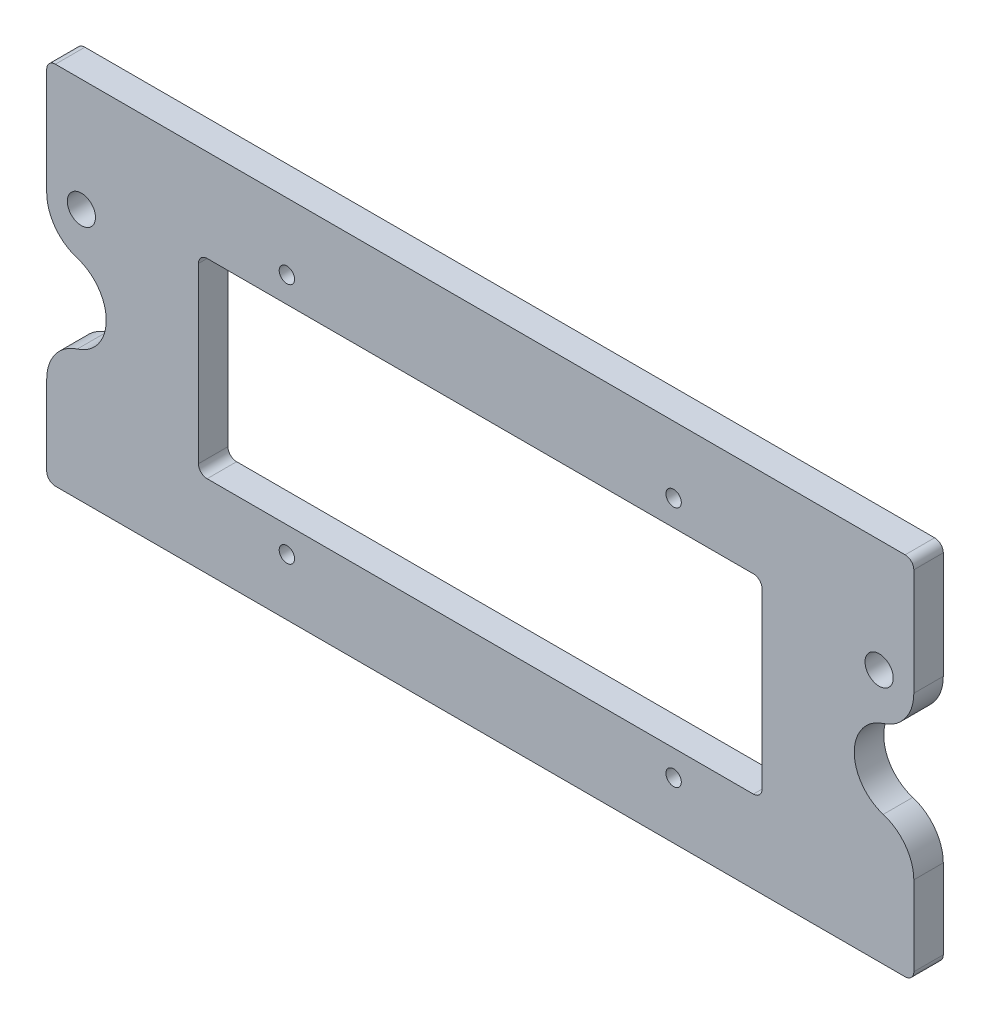
ISO-10303-21;
HEADER;
FILE_DESCRIPTION(('STEP AP214'),'2;1');
FILE_NAME('part.step','',(''),(''),'','','');
FILE_SCHEMA(('AUTOMOTIVE_DESIGN { 1 0 10303 214 1 1 1 1 }'));
ENDSEC;
DATA;
#1=APPLICATION_CONTEXT('core data for automotive mechanical design processes');
#2=APPLICATION_PROTOCOL_DEFINITION('international standard','automotive_design',2000,#1);
#3=PRODUCT_CONTEXT('',#1,'mechanical');
#4=PRODUCT('Part','Part','',(#3));
#5=PRODUCT_RELATED_PRODUCT_CATEGORY('part','',(#4));
#6=PRODUCT_DEFINITION_FORMATION('','',#4);
#7=PRODUCT_DEFINITION_CONTEXT('part definition',#1,'design');
#8=PRODUCT_DEFINITION('design','',#6,#7);
#9=PRODUCT_DEFINITION_SHAPE('','',#8);
#10=(LENGTH_UNIT() NAMED_UNIT(*) SI_UNIT(.MILLI.,.METRE.));
#11=(NAMED_UNIT(*) PLANE_ANGLE_UNIT() SI_UNIT($,.RADIAN.));
#12=(NAMED_UNIT(*) SI_UNIT($,.STERADIAN.) SOLID_ANGLE_UNIT());
#13=UNCERTAINTY_MEASURE_WITH_UNIT(LENGTH_MEASURE(1.E-05),#10,'distance_accuracy_value','');
#14=(GEOMETRIC_REPRESENTATION_CONTEXT(3) GLOBAL_UNCERTAINTY_ASSIGNED_CONTEXT((#13)) GLOBAL_UNIT_ASSIGNED_CONTEXT((#10,
#11,#12)) REPRESENTATION_CONTEXT('',''));
#15=CARTESIAN_POINT('',(0.,0.,0.));
#16=DIRECTION('',(0.,0.,1.));
#17=DIRECTION('',(1.,0.,0.));
#18=AXIS2_PLACEMENT_3D('',#15,#16,#17);
#19=CARTESIAN_POINT('',(100.,-42.15,6.8));
#20=DIRECTION('',(-1.,0.,0.));
#21=DIRECTION('',(0.,0.,1.));
#22=AXIS2_PLACEMENT_3D('',#19,#20,#21);
#23=PLANE('',#22);
#24=DIRECTION('',(0.,1.,0.));
#25=VECTOR('',#24,1.);
#26=CARTESIAN_POINT('',(100.,-42.15,6.8));
#27=LINE('',#26,#25);
#28=CARTESIAN_POINT('',(100.,15.4785660950768,6.8));
#29=VERTEX_POINT('',#28);
#30=CARTESIAN_POINT('',(100.,40.15,6.8));
#31=VERTEX_POINT('',#30);
#32=EDGE_CURVE('E572',#29,#31,#27,.T.);
#33=ORIENTED_EDGE('',*,*,#32,.F.);
#34=DIRECTION('',(0.,0.,-1.));
#35=VECTOR('',#34,1.);
#36=CARTESIAN_POINT('',(100.,15.4785660950769,0.));
#37=LINE('',#36,#35);
#38=CARTESIAN_POINT('',(100.,15.4785660950768,0.));
#39=VERTEX_POINT('',#38);
#40=EDGE_CURVE('E416',#29,#39,#37,.T.);
#41=ORIENTED_EDGE('',*,*,#40,.T.);
#42=DIRECTION('',(0.,1.,0.));
#43=VECTOR('',#42,1.);
#44=CARTESIAN_POINT('',(100.,-42.15,0.));
#45=LINE('',#44,#43);
#46=CARTESIAN_POINT('',(100.,40.15,0.));
#47=VERTEX_POINT('',#46);
#48=EDGE_CURVE('E295',#39,#47,#45,.T.);
#49=ORIENTED_EDGE('',*,*,#48,.T.);
#50=DIRECTION('',(0.,0.,-1.));
#51=VECTOR('',#50,1.);
#52=CARTESIAN_POINT('',(100.,40.15,6.8));
#53=LINE('',#52,#51);
#54=EDGE_CURVE('E264',#47,#31,#53,.F.);
#55=ORIENTED_EDGE('',*,*,#54,.T.);
#56=EDGE_LOOP('',(#33,#41,#49,#55));
#57=FACE_BOUND('',#56,.T.);
#58=ADVANCED_FACE('F48',(#57),#23,.F.);
#59=CARTESIAN_POINT('',(100.,-40.15,0.));
#60=VERTEX_POINT('',#59);
#61=CARTESIAN_POINT('',(100.,-21.7786158665726,0.));
#62=VERTEX_POINT('',#61);
#63=EDGE_CURVE('E286',#60,#62,#45,.T.);
#64=ORIENTED_EDGE('',*,*,#63,.T.);
#65=DIRECTION('',(0.,0.,-1.));
#66=VECTOR('',#65,1.);
#67=CARTESIAN_POINT('',(100.,-21.7786158665726,6.8));
#68=LINE('',#67,#66);
#69=CARTESIAN_POINT('',(100.,-21.7786158665726,6.8));
#70=VERTEX_POINT('',#69);
#71=EDGE_CURVE('E429',#62,#70,#68,.F.);
#72=ORIENTED_EDGE('',*,*,#71,.T.);
#73=CARTESIAN_POINT('',(100.,-40.15,6.8));
#74=VERTEX_POINT('',#73);
#75=EDGE_CURVE('E573',#74,#70,#27,.T.);
#76=ORIENTED_EDGE('',*,*,#75,.F.);
#77=DIRECTION('',(0.,0.,-1.));
#78=VECTOR('',#77,1.);
#79=CARTESIAN_POINT('',(100.,-40.15,6.8));
#80=LINE('',#79,#78);
#81=EDGE_CURVE('E268',#74,#60,#80,.T.);
#82=ORIENTED_EDGE('',*,*,#81,.T.);
#83=EDGE_LOOP('',(#64,#72,#76,#82));
#84=FACE_BOUND('',#83,.T.);
#85=ADVANCED_FACE('F593',(#84),#23,.F.);
#86=CARTESIAN_POINT('',(0.,0.,6.8));
#87=DIRECTION('',(0.,0.,1.));
#88=DIRECTION('',(1.,0.,0.));
#89=AXIS2_PLACEMENT_3D('',#86,#87,#88);
#90=PLANE('',#89);
#91=CARTESIAN_POINT('',(-44.6,-29.0722,6.8));
#92=DIRECTION('',(0.,0.,1.));
#93=DIRECTION('',(1.,0.,0.));
#94=AXIS2_PLACEMENT_3D('',#91,#92,#93);
#95=CIRCLE('',#94,1.775);
#96=CARTESIAN_POINT('',(-42.825,-29.0722,6.8));
#97=VERTEX_POINT('',#96);
#98=EDGE_CURVE('E450',#97,#97,#95,.T.);
#99=ORIENTED_EDGE('',*,*,#98,.F.);
#100=EDGE_LOOP('',(#99));
#101=FACE_BOUND('',#100,.T.);
#102=CARTESIAN_POINT('',(44.6,-29.0722,6.8));
#103=DIRECTION('',(0.,0.,1.));
#104=DIRECTION('',(1.,0.,0.));
#105=AXIS2_PLACEMENT_3D('',#102,#103,#104);
#106=CIRCLE('',#105,1.775);
#107=CARTESIAN_POINT('',(46.375,-29.0722,6.8));
#108=VERTEX_POINT('',#107);
#109=EDGE_CURVE('E501',#108,#108,#106,.T.);
#110=ORIENTED_EDGE('',*,*,#109,.F.);
#111=EDGE_LOOP('',(#110));
#112=FACE_BOUND('',#111,.T.);
#113=CARTESIAN_POINT('',(44.6,26.7722,6.8));
#114=DIRECTION('',(0.,0.,1.));
#115=DIRECTION('',(1.,0.,0.));
#116=AXIS2_PLACEMENT_3D('',#113,#114,#115);
#117=CIRCLE('',#116,1.775);
#118=CARTESIAN_POINT('',(46.375,26.7722,6.8));
#119=VERTEX_POINT('',#118);
#120=EDGE_CURVE('E509',#119,#119,#117,.T.);
#121=ORIENTED_EDGE('',*,*,#120,.F.);
#122=EDGE_LOOP('',(#121));
#123=FACE_BOUND('',#122,.T.);
#124=CARTESIAN_POINT('',(-44.6,26.7722,6.8));
#125=DIRECTION('',(0.,0.,1.));
#126=DIRECTION('',(1.,0.,0.));
#127=AXIS2_PLACEMENT_3D('',#124,#125,#126);
#128=CIRCLE('',#127,1.775);
#129=CARTESIAN_POINT('',(-42.825,26.7722,6.8));
#130=VERTEX_POINT('',#129);
#131=EDGE_CURVE('E517',#130,#130,#128,.T.);
#132=ORIENTED_EDGE('',*,*,#131,.F.);
#133=EDGE_LOOP('',(#132));
#134=FACE_BOUND('',#133,.T.);
#135=DIRECTION('',(0.,-1.,0.));
#136=VECTOR('',#135,1.);
#137=CARTESIAN_POINT('',(-65.,20.85,6.8));
#138=LINE('',#137,#136);
#139=CARTESIAN_POINT('',(-65.,18.85,6.8));
#140=VERTEX_POINT('',#139);
#141=CARTESIAN_POINT('',(-65.,-21.15,6.8));
#142=VERTEX_POINT('',#141);
#143=EDGE_CURVE('E525',#140,#142,#138,.T.);
#144=ORIENTED_EDGE('',*,*,#143,.F.);
#145=CARTESIAN_POINT('',(-63.,18.85,6.8));
#146=DIRECTION('',(0.,0.,1.));
#147=DIRECTION('',(1.,0.,0.));
#148=AXIS2_PLACEMENT_3D('',#145,#146,#147);
#149=CIRCLE('',#148,2.);
#150=CARTESIAN_POINT('',(-63.,20.85,6.8));
#151=VERTEX_POINT('',#150);
#152=EDGE_CURVE('E377',#140,#151,#149,.F.);
#153=ORIENTED_EDGE('',*,*,#152,.T.);
#154=DIRECTION('',(-1.,0.,0.));
#155=VECTOR('',#154,1.);
#156=CARTESIAN_POINT('',(65.,20.85,6.8));
#157=LINE('',#156,#155);
#158=CARTESIAN_POINT('',(63.,20.85,6.8));
#159=VERTEX_POINT('',#158);
#160=EDGE_CURVE('E534',#159,#151,#157,.T.);
#161=ORIENTED_EDGE('',*,*,#160,.F.);
#162=CARTESIAN_POINT('',(63.,18.85,6.8));
#163=DIRECTION('',(0.,0.,1.));
#164=DIRECTION('',(1.,0.,0.));
#165=AXIS2_PLACEMENT_3D('',#162,#163,#164);
#166=CIRCLE('',#165,2.);
#167=CARTESIAN_POINT('',(65.,18.85,6.8));
#168=VERTEX_POINT('',#167);
#169=EDGE_CURVE('E365',#159,#168,#166,.F.);
#170=ORIENTED_EDGE('',*,*,#169,.T.);
#171=DIRECTION('',(0.,1.,0.));
#172=VECTOR('',#171,1.);
#173=CARTESIAN_POINT('',(65.,-23.15,6.8));
#174=LINE('',#173,#172);
#175=CARTESIAN_POINT('',(65.,-21.15,6.8));
#176=VERTEX_POINT('',#175);
#177=EDGE_CURVE('E554',#176,#168,#174,.T.);
#178=ORIENTED_EDGE('',*,*,#177,.F.);
#179=CARTESIAN_POINT('',(63.,-21.15,6.8));
#180=DIRECTION('',(0.,0.,1.));
#181=DIRECTION('',(1.,0.,0.));
#182=AXIS2_PLACEMENT_3D('',#179,#180,#181);
#183=CIRCLE('',#182,2.);
#184=CARTESIAN_POINT('',(63.,-23.15,6.8));
#185=VERTEX_POINT('',#184);
#186=EDGE_CURVE('E371',#176,#185,#183,.F.);
#187=ORIENTED_EDGE('',*,*,#186,.T.);
#188=DIRECTION('',(1.,0.,0.));
#189=VECTOR('',#188,1.);
#190=CARTESIAN_POINT('',(-65.,-23.15,6.8));
#191=LINE('',#190,#189);
#192=CARTESIAN_POINT('',(-63.,-23.15,6.8));
#193=VERTEX_POINT('',#192);
#194=EDGE_CURVE('E550',#193,#185,#191,.T.);
#195=ORIENTED_EDGE('',*,*,#194,.F.);
#196=CARTESIAN_POINT('',(-63.,-21.15,6.8));
#197=DIRECTION('',(0.,0.,1.));
#198=DIRECTION('',(1.,0.,0.));
#199=AXIS2_PLACEMENT_3D('',#196,#197,#198);
#200=CIRCLE('',#199,2.);
#201=EDGE_CURVE('E383',#193,#142,#200,.F.);
#202=ORIENTED_EDGE('',*,*,#201,.T.);
#203=EDGE_LOOP('',(#144,#153,#161,#170,#178,#187,#195,#202));
#204=FACE_BOUND('',#203,.T.);
#205=CARTESIAN_POINT('',(92.,16.15,6.8));
#206=DIRECTION('',(0.,0.,1.));
#207=DIRECTION('',(1.,0.,0.));
#208=AXIS2_PLACEMENT_3D('',#205,#206,#207);
#209=CIRCLE('',#208,3.25000000000001);
#210=CARTESIAN_POINT('',(95.25,16.15,6.8));
#211=VERTEX_POINT('',#210);
#212=EDGE_CURVE('E546',#211,#211,#209,.T.);
#213=ORIENTED_EDGE('',*,*,#212,.F.);
#214=EDGE_LOOP('',(#213));
#215=FACE_BOUND('',#214,.T.);
#216=CARTESIAN_POINT('',(-92.,16.15,6.8));
#217=DIRECTION('',(0.,0.,1.));
#218=DIRECTION('',(1.,0.,0.));
#219=AXIS2_PLACEMENT_3D('',#216,#217,#218);
#220=CIRCLE('',#219,3.25000000000001);
#221=CARTESIAN_POINT('',(-88.75,16.15,6.8));
#222=VERTEX_POINT('',#221);
#223=EDGE_CURVE('E470',#222,#222,#220,.T.);
#224=ORIENTED_EDGE('',*,*,#223,.F.);
#225=EDGE_LOOP('',(#224));
#226=FACE_BOUND('',#225,.T.);
#227=CARTESIAN_POINT('',(95.7641649932263,-3.15002488574789,6.8));
#228=DIRECTION('',(0.,0.,-1.));
#229=DIRECTION('',(-1.,0.,0.));
#230=AXIS2_PLACEMENT_3D('',#227,#228,#229);
#231=CIRCLE('',#230,9.5);
#232=CARTESIAN_POINT('',(92.9559820478083,-12.2254922866625,6.8));
#233=VERTEX_POINT('',#232);
#234=CARTESIAN_POINT('',(92.9559820478083,5.92544251516673,6.8));
#235=VERTEX_POINT('',#234);
#236=EDGE_CURVE('E451',#233,#235,#231,.T.);
#237=ORIENTED_EDGE('',*,*,#236,.T.);
#238=CARTESIAN_POINT('',(90.,15.4785660950769,6.8));
#239=DIRECTION('',(0.,0.,1.));
#240=DIRECTION('',(1.,0.,0.));
#241=AXIS2_PLACEMENT_3D('',#238,#239,#240);
#242=CIRCLE('',#241,10.);
#243=EDGE_CURVE('E413',#235,#29,#242,.T.);
#244=ORIENTED_EDGE('',*,*,#243,.T.);
#245=ORIENTED_EDGE('',*,*,#32,.T.);
#246=CARTESIAN_POINT('',(98.,40.15,6.8));
#247=DIRECTION('',(0.,0.,1.));
#248=DIRECTION('',(1.,0.,0.));
#249=AXIS2_PLACEMENT_3D('',#246,#247,#248);
#250=CIRCLE('',#249,2.);
#251=CARTESIAN_POINT('',(98.,42.15,6.8));
#252=VERTEX_POINT('',#251);
#253=EDGE_CURVE('E320',#31,#252,#250,.T.);
#254=ORIENTED_EDGE('',*,*,#253,.T.);
#255=DIRECTION('',(-1.,0.,0.));
#256=VECTOR('',#255,1.);
#257=CARTESIAN_POINT('',(100.,42.15,6.8));
#258=LINE('',#257,#256);
#259=CARTESIAN_POINT('',(-98.,42.15,6.8));
#260=VERTEX_POINT('',#259);
#261=EDGE_CURVE('E278',#252,#260,#258,.T.);
#262=ORIENTED_EDGE('',*,*,#261,.T.);
#263=CARTESIAN_POINT('',(-98.,40.15,6.8));
#264=DIRECTION('',(0.,0.,1.));
#265=DIRECTION('',(1.,0.,0.));
#266=AXIS2_PLACEMENT_3D('',#263,#264,#265);
#267=CIRCLE('',#266,2.);
#268=CARTESIAN_POINT('',(-100.,40.15,6.8));
#269=VERTEX_POINT('',#268);
#270=EDGE_CURVE('E312',#260,#269,#267,.T.);
#271=ORIENTED_EDGE('',*,*,#270,.T.);
#272=DIRECTION('',(0.,-1.,0.));
#273=VECTOR('',#272,1.);
#274=CARTESIAN_POINT('',(-100.,-42.15,6.8));
#275=LINE('',#274,#273);
#276=CARTESIAN_POINT('',(-100.,15.4785660950768,6.8));
#277=VERTEX_POINT('',#276);
#278=EDGE_CURVE('E291',#269,#277,#275,.T.);
#279=ORIENTED_EDGE('',*,*,#278,.T.);
#280=CARTESIAN_POINT('',(-90.,15.4785660950769,6.8));
#281=DIRECTION('',(0.,0.,1.));
#282=DIRECTION('',(1.,0.,0.));
#283=AXIS2_PLACEMENT_3D('',#280,#281,#282);
#284=CIRCLE('',#283,10.);
#285=CARTESIAN_POINT('',(-92.9559820478083,5.92544251516673,6.8));
#286=VERTEX_POINT('',#285);
#287=EDGE_CURVE('E404',#277,#286,#284,.T.);
#288=ORIENTED_EDGE('',*,*,#287,.T.);
#289=CARTESIAN_POINT('',(-95.7641649932263,-3.15002488574789,6.8));
#290=DIRECTION('',(0.,0.,1.));
#291=DIRECTION('',(1.,0.,0.));
#292=AXIS2_PLACEMENT_3D('',#289,#290,#291);
#293=CIRCLE('',#292,9.5);
#294=CARTESIAN_POINT('',(-92.9559820478083,-12.2254922866625,6.8));
#295=VERTEX_POINT('',#294);
#296=EDGE_CURVE('E442',#295,#286,#293,.T.);
#297=ORIENTED_EDGE('',*,*,#296,.F.);
#298=CARTESIAN_POINT('',(-90.,-21.7786158665726,6.8));
#299=DIRECTION('',(0.,0.,1.));
#300=DIRECTION('',(1.,0.,0.));
#301=AXIS2_PLACEMENT_3D('',#298,#299,#300);
#302=CIRCLE('',#301,10.);
#303=CARTESIAN_POINT('',(-100.,-21.7786158665726,6.8));
#304=VERTEX_POINT('',#303);
#305=EDGE_CURVE('E407',#295,#304,#302,.T.);
#306=ORIENTED_EDGE('',*,*,#305,.T.);
#307=CARTESIAN_POINT('',(-100.,-40.15,6.8));
#308=VERTEX_POINT('',#307);
#309=EDGE_CURVE('E285',#304,#308,#275,.T.);
#310=ORIENTED_EDGE('',*,*,#309,.T.);
#311=CARTESIAN_POINT('',(-98.,-40.15,6.8));
#312=DIRECTION('',(0.,0.,1.));
#313=DIRECTION('',(1.,0.,0.));
#314=AXIS2_PLACEMENT_3D('',#311,#312,#313);
#315=CIRCLE('',#314,2.);
#316=CARTESIAN_POINT('',(-98.,-42.15,6.8));
#317=VERTEX_POINT('',#316);
#318=EDGE_CURVE('E315',#308,#317,#315,.T.);
#319=ORIENTED_EDGE('',*,*,#318,.T.);
#320=DIRECTION('',(1.,0.,0.));
#321=VECTOR('',#320,1.);
#322=CARTESIAN_POINT('',(100.,-42.15,6.8));
#323=LINE('',#322,#321);
#324=CARTESIAN_POINT('',(98.,-42.15,6.8));
#325=VERTEX_POINT('',#324);
#326=EDGE_CURVE('E570',#317,#325,#323,.T.);
#327=ORIENTED_EDGE('',*,*,#326,.T.);
#328=CARTESIAN_POINT('',(98.,-40.15,6.8));
#329=DIRECTION('',(0.,0.,1.));
#330=DIRECTION('',(1.,0.,0.));
#331=AXIS2_PLACEMENT_3D('',#328,#329,#330);
#332=CIRCLE('',#331,2.);
#333=EDGE_CURVE('E318',#325,#74,#332,.T.);
#334=ORIENTED_EDGE('',*,*,#333,.T.);
#335=ORIENTED_EDGE('',*,*,#75,.T.);
#336=CARTESIAN_POINT('',(90.,-21.7786158665726,6.8));
#337=DIRECTION('',(0.,0.,1.));
#338=DIRECTION('',(1.,0.,0.));
#339=AXIS2_PLACEMENT_3D('',#336,#337,#338);
#340=CIRCLE('',#339,10.);
#341=EDGE_CURVE('E410',#70,#233,#340,.T.);
#342=ORIENTED_EDGE('',*,*,#341,.T.);
#343=EDGE_LOOP('',(#237,#244,#245,#254,#262,#271,#279,#288,#297,#306,#310,#319,#327,#334,#335,#342));
#344=FACE_BOUND('',#343,.T.);
#345=ADVANCED_FACE('F447',(#101,#112,#123,#134,#204,#215,#226,#344),#90,.T.);
#346=CARTESIAN_POINT('',(0.,0.,0.));
#347=DIRECTION('',(0.,0.,1.));
#348=DIRECTION('',(1.,0.,0.));
#349=AXIS2_PLACEMENT_3D('',#346,#347,#348);
#350=PLANE('',#349);
#351=CARTESIAN_POINT('',(-92.,16.15,0.));
#352=DIRECTION('',(0.,0.,1.));
#353=DIRECTION('',(1.,0.,0.));
#354=AXIS2_PLACEMENT_3D('',#351,#352,#353);
#355=CIRCLE('',#354,3.25000000000001);
#356=CARTESIAN_POINT('',(-88.75,16.15,0.));
#357=VERTEX_POINT('',#356);
#358=EDGE_CURVE('E463',#357,#357,#355,.T.);
#359=ORIENTED_EDGE('',*,*,#358,.T.);
#360=EDGE_LOOP('',(#359));
#361=FACE_BOUND('',#360,.T.);
#362=CARTESIAN_POINT('',(92.,16.15,0.));
#363=DIRECTION('',(0.,0.,1.));
#364=DIRECTION('',(1.,0.,0.));
#365=AXIS2_PLACEMENT_3D('',#362,#363,#364);
#366=CIRCLE('',#365,3.25000000000001);
#367=CARTESIAN_POINT('',(95.25,16.15,0.));
#368=VERTEX_POINT('',#367);
#369=EDGE_CURVE('E560',#368,#368,#366,.T.);
#370=ORIENTED_EDGE('',*,*,#369,.T.);
#371=EDGE_LOOP('',(#370));
#372=FACE_BOUND('',#371,.T.);
#373=DIRECTION('',(0.,1.,0.));
#374=VECTOR('',#373,1.);
#375=CARTESIAN_POINT('',(65.,-23.15,0.));
#376=LINE('',#375,#374);
#377=CARTESIAN_POINT('',(65.,-21.15,0.));
#378=VERTEX_POINT('',#377);
#379=CARTESIAN_POINT('',(65.,18.85,0.));
#380=VERTEX_POINT('',#379);
#381=EDGE_CURVE('E538',#378,#380,#376,.T.);
#382=ORIENTED_EDGE('',*,*,#381,.T.);
#383=CARTESIAN_POINT('',(63.,18.85,0.));
#384=DIRECTION('',(0.,0.,1.));
#385=DIRECTION('',(1.,0.,0.));
#386=AXIS2_PLACEMENT_3D('',#383,#384,#385);
#387=CIRCLE('',#386,2.);
#388=CARTESIAN_POINT('',(63.,20.85,0.));
#389=VERTEX_POINT('',#388);
#390=EDGE_CURVE('E368',#380,#389,#387,.T.);
#391=ORIENTED_EDGE('',*,*,#390,.T.);
#392=DIRECTION('',(-1.,0.,0.));
#393=VECTOR('',#392,1.);
#394=CARTESIAN_POINT('',(65.,20.85,0.));
#395=LINE('',#394,#393);
#396=CARTESIAN_POINT('',(-63.,20.85,0.));
#397=VERTEX_POINT('',#396);
#398=EDGE_CURVE('E542',#389,#397,#395,.T.);
#399=ORIENTED_EDGE('',*,*,#398,.T.);
#400=CARTESIAN_POINT('',(-63.,18.85,0.));
#401=DIRECTION('',(0.,0.,1.));
#402=DIRECTION('',(1.,0.,0.));
#403=AXIS2_PLACEMENT_3D('',#400,#401,#402);
#404=CIRCLE('',#403,2.);
#405=CARTESIAN_POINT('',(-65.,18.85,0.));
#406=VERTEX_POINT('',#405);
#407=EDGE_CURVE('E380',#397,#406,#404,.T.);
#408=ORIENTED_EDGE('',*,*,#407,.T.);
#409=DIRECTION('',(0.,-1.,0.));
#410=VECTOR('',#409,1.);
#411=CARTESIAN_POINT('',(-65.,20.85,0.));
#412=LINE('',#411,#410);
#413=CARTESIAN_POINT('',(-65.,-21.15,0.));
#414=VERTEX_POINT('',#413);
#415=EDGE_CURVE('E529',#406,#414,#412,.T.);
#416=ORIENTED_EDGE('',*,*,#415,.T.);
#417=CARTESIAN_POINT('',(-63.,-21.15,0.));
#418=DIRECTION('',(0.,0.,1.));
#419=DIRECTION('',(1.,0.,0.));
#420=AXIS2_PLACEMENT_3D('',#417,#418,#419);
#421=CIRCLE('',#420,2.);
#422=CARTESIAN_POINT('',(-63.,-23.15,0.));
#423=VERTEX_POINT('',#422);
#424=EDGE_CURVE('E386',#414,#423,#421,.T.);
#425=ORIENTED_EDGE('',*,*,#424,.T.);
#426=DIRECTION('',(1.,0.,0.));
#427=VECTOR('',#426,1.);
#428=CARTESIAN_POINT('',(-65.,-23.15,0.));
#429=LINE('',#428,#427);
#430=CARTESIAN_POINT('',(63.,-23.15,0.));
#431=VERTEX_POINT('',#430);
#432=EDGE_CURVE('E533',#423,#431,#429,.T.);
#433=ORIENTED_EDGE('',*,*,#432,.T.);
#434=CARTESIAN_POINT('',(63.,-21.15,0.));
#435=DIRECTION('',(0.,0.,1.));
#436=DIRECTION('',(1.,0.,0.));
#437=AXIS2_PLACEMENT_3D('',#434,#435,#436);
#438=CIRCLE('',#437,2.);
#439=EDGE_CURVE('E374',#431,#378,#438,.T.);
#440=ORIENTED_EDGE('',*,*,#439,.T.);
#441=EDGE_LOOP('',(#382,#391,#399,#408,#416,#425,#433,#440));
#442=FACE_BOUND('',#441,.T.);
#443=CARTESIAN_POINT('',(-44.6,26.7722,0.));
#444=DIRECTION('',(0.,0.,1.));
#445=DIRECTION('',(1.,0.,0.));
#446=AXIS2_PLACEMENT_3D('',#443,#444,#445);
#447=CIRCLE('',#446,1.775);
#448=CARTESIAN_POINT('',(-42.825,26.7722,0.));
#449=VERTEX_POINT('',#448);
#450=EDGE_CURVE('E521',#449,#449,#447,.T.);
#451=ORIENTED_EDGE('',*,*,#450,.T.);
#452=EDGE_LOOP('',(#451));
#453=FACE_BOUND('',#452,.T.);
#454=CARTESIAN_POINT('',(44.6,26.7722,0.));
#455=DIRECTION('',(0.,0.,1.));
#456=DIRECTION('',(1.,0.,0.));
#457=AXIS2_PLACEMENT_3D('',#454,#455,#456);
#458=CIRCLE('',#457,1.775);
#459=CARTESIAN_POINT('',(46.375,26.7722,0.));
#460=VERTEX_POINT('',#459);
#461=EDGE_CURVE('E513',#460,#460,#458,.T.);
#462=ORIENTED_EDGE('',*,*,#461,.T.);
#463=EDGE_LOOP('',(#462));
#464=FACE_BOUND('',#463,.T.);
#465=CARTESIAN_POINT('',(44.6,-29.0722,0.));
#466=DIRECTION('',(0.,0.,1.));
#467=DIRECTION('',(1.,0.,0.));
#468=AXIS2_PLACEMENT_3D('',#465,#466,#467);
#469=CIRCLE('',#468,1.775);
#470=CARTESIAN_POINT('',(46.375,-29.0722,0.));
#471=VERTEX_POINT('',#470);
#472=EDGE_CURVE('E505',#471,#471,#469,.T.);
#473=ORIENTED_EDGE('',*,*,#472,.T.);
#474=EDGE_LOOP('',(#473));
#475=FACE_BOUND('',#474,.T.);
#476=CARTESIAN_POINT('',(-44.6,-29.0722,0.));
#477=DIRECTION('',(0.,0.,1.));
#478=DIRECTION('',(1.,0.,0.));
#479=AXIS2_PLACEMENT_3D('',#476,#477,#478);
#480=CIRCLE('',#479,1.775);
#481=CARTESIAN_POINT('',(-42.825,-29.0722,0.));
#482=VERTEX_POINT('',#481);
#483=EDGE_CURVE('E497',#482,#482,#480,.T.);
#484=ORIENTED_EDGE('',*,*,#483,.T.);
#485=EDGE_LOOP('',(#484));
#486=FACE_BOUND('',#485,.T.);
#487=ORIENTED_EDGE('',*,*,#48,.F.);
#488=CARTESIAN_POINT('',(90.,15.4785660950769,0.));
#489=DIRECTION('',(0.,0.,1.));
#490=DIRECTION('',(1.,0.,0.));
#491=AXIS2_PLACEMENT_3D('',#488,#489,#490);
#492=CIRCLE('',#491,10.);
#493=CARTESIAN_POINT('',(92.9559820478083,5.92544251516673,0.));
#494=VERTEX_POINT('',#493);
#495=EDGE_CURVE('E427',#39,#494,#492,.F.);
#496=ORIENTED_EDGE('',*,*,#495,.T.);
#497=CARTESIAN_POINT('',(95.7641649932263,-3.15002488574789,0.));
#498=DIRECTION('',(0.,0.,1.));
#499=DIRECTION('',(1.,0.,0.));
#500=AXIS2_PLACEMENT_3D('',#497,#498,#499);
#501=CIRCLE('',#500,9.5);
#502=CARTESIAN_POINT('',(92.9559820478083,-12.2254922866625,0.));
#503=VERTEX_POINT('',#502);
#504=EDGE_CURVE('E392',#503,#494,#501,.F.);
#505=ORIENTED_EDGE('',*,*,#504,.F.);
#506=CARTESIAN_POINT('',(90.,-21.7786158665726,0.));
#507=DIRECTION('',(0.,0.,1.));
#508=DIRECTION('',(1.,0.,0.));
#509=AXIS2_PLACEMENT_3D('',#506,#507,#508);
#510=CIRCLE('',#509,10.);
#511=EDGE_CURVE('E424',#503,#62,#510,.F.);
#512=ORIENTED_EDGE('',*,*,#511,.T.);
#513=ORIENTED_EDGE('',*,*,#63,.F.);
#514=CARTESIAN_POINT('',(98.,-40.15,0.));
#515=DIRECTION('',(0.,0.,1.));
#516=DIRECTION('',(1.,0.,0.));
#517=AXIS2_PLACEMENT_3D('',#514,#515,#516);
#518=CIRCLE('',#517,2.);
#519=CARTESIAN_POINT('',(98.,-42.15,0.));
#520=VERTEX_POINT('',#519);
#521=EDGE_CURVE('E269',#60,#520,#518,.F.);
#522=ORIENTED_EDGE('',*,*,#521,.T.);
#523=DIRECTION('',(1.,0.,0.));
#524=VECTOR('',#523,1.);
#525=CARTESIAN_POINT('',(100.,-42.15,0.));
#526=LINE('',#525,#524);
#527=CARTESIAN_POINT('',(-98.,-42.15,0.));
#528=VERTEX_POINT('',#527);
#529=EDGE_CURVE('E467',#528,#520,#526,.T.);
#530=ORIENTED_EDGE('',*,*,#529,.F.);
#531=CARTESIAN_POINT('',(-98.,-40.15,0.));
#532=DIRECTION('',(0.,0.,1.));
#533=DIRECTION('',(1.,0.,0.));
#534=AXIS2_PLACEMENT_3D('',#531,#532,#533);
#535=CIRCLE('',#534,2.);
#536=CARTESIAN_POINT('',(-100.,-40.15,0.));
#537=VERTEX_POINT('',#536);
#538=EDGE_CURVE('E303',#528,#537,#535,.F.);
#539=ORIENTED_EDGE('',*,*,#538,.T.);
#540=DIRECTION('',(0.,-1.,0.));
#541=VECTOR('',#540,1.);
#542=CARTESIAN_POINT('',(-100.,-42.15,0.));
#543=LINE('',#542,#541);
#544=CARTESIAN_POINT('',(-100.,-21.7786158665726,0.));
#545=VERTEX_POINT('',#544);
#546=EDGE_CURVE('E458',#545,#537,#543,.T.);
#547=ORIENTED_EDGE('',*,*,#546,.F.);
#548=CARTESIAN_POINT('',(-90.,-21.7786158665726,0.));
#549=DIRECTION('',(0.,0.,1.));
#550=DIRECTION('',(1.,0.,0.));
#551=AXIS2_PLACEMENT_3D('',#548,#549,#550);
#552=CIRCLE('',#551,10.);
#553=CARTESIAN_POINT('',(-92.9559820478083,-12.2254922866625,0.));
#554=VERTEX_POINT('',#553);
#555=EDGE_CURVE('E421',#545,#554,#552,.F.);
#556=ORIENTED_EDGE('',*,*,#555,.T.);
#557=CARTESIAN_POINT('',(-95.7641649932263,-3.15002488574789,0.));
#558=DIRECTION('',(0.,0.,1.));
#559=DIRECTION('',(1.,0.,0.));
#560=AXIS2_PLACEMENT_3D('',#557,#558,#559);
#561=CIRCLE('',#560,9.5);
#562=CARTESIAN_POINT('',(-92.9559820478083,5.92544251516673,0.));
#563=VERTEX_POINT('',#562);
#564=EDGE_CURVE('E389',#554,#563,#561,.T.);
#565=ORIENTED_EDGE('',*,*,#564,.T.);
#566=CARTESIAN_POINT('',(-90.,15.4785660950769,0.));
#567=DIRECTION('',(0.,0.,1.));
#568=DIRECTION('',(1.,0.,0.));
#569=AXIS2_PLACEMENT_3D('',#566,#567,#568);
#570=CIRCLE('',#569,10.);
#571=CARTESIAN_POINT('',(-100.,15.4785660950768,0.));
#572=VERTEX_POINT('',#571);
#573=EDGE_CURVE('E67',#563,#572,#570,.F.);
#574=ORIENTED_EDGE('',*,*,#573,.T.);
#575=CARTESIAN_POINT('',(-100.,40.15,0.));
#576=VERTEX_POINT('',#575);
#577=EDGE_CURVE('E462',#576,#572,#543,.T.);
#578=ORIENTED_EDGE('',*,*,#577,.F.);
#579=CARTESIAN_POINT('',(-98.,40.15,0.));
#580=DIRECTION('',(0.,0.,1.));
#581=DIRECTION('',(1.,0.,0.));
#582=AXIS2_PLACEMENT_3D('',#579,#580,#581);
#583=CIRCLE('',#582,2.);
#584=CARTESIAN_POINT('',(-98.,42.15,0.));
#585=VERTEX_POINT('',#584);
#586=EDGE_CURVE('E280',#576,#585,#583,.F.);
#587=ORIENTED_EDGE('',*,*,#586,.T.);
#588=DIRECTION('',(-1.,0.,0.));
#589=VECTOR('',#588,1.);
#590=CARTESIAN_POINT('',(100.,42.15,0.));
#591=LINE('',#590,#589);
#592=CARTESIAN_POINT('',(98.,42.15,0.));
#593=VERTEX_POINT('',#592);
#594=EDGE_CURVE('E275',#593,#585,#591,.T.);
#595=ORIENTED_EDGE('',*,*,#594,.F.);
#596=CARTESIAN_POINT('',(98.,40.15,0.));
#597=DIRECTION('',(0.,0.,1.));
#598=DIRECTION('',(1.,0.,0.));
#599=AXIS2_PLACEMENT_3D('',#596,#597,#598);
#600=CIRCLE('',#599,2.);
#601=EDGE_CURVE('E258',#593,#47,#600,.F.);
#602=ORIENTED_EDGE('',*,*,#601,.T.);
#603=EDGE_LOOP('',(#487,#496,#505,#512,#513,#522,#530,#539,#547,#556,#565,#574,#578,#587,#595,#602));
#604=FACE_BOUND('',#603,.T.);
#605=ADVANCED_FACE('F283',(#361,#372,#442,#453,#464,#475,#486,#604),#350,.F.);
#606=CARTESIAN_POINT('',(-100.,-42.15,6.8));
#607=DIRECTION('',(1.,0.,0.));
#608=DIRECTION('',(0.,0.,-1.));
#609=AXIS2_PLACEMENT_3D('',#606,#607,#608);
#610=PLANE('',#609);
#611=ORIENTED_EDGE('',*,*,#309,.F.);
#612=DIRECTION('',(0.,0.,1.));
#613=VECTOR('',#612,1.);
#614=CARTESIAN_POINT('',(-100.,-21.7786158665726,6.8));
#615=LINE('',#614,#613);
#616=EDGE_CURVE('E432',#304,#545,#615,.F.);
#617=ORIENTED_EDGE('',*,*,#616,.T.);
#618=ORIENTED_EDGE('',*,*,#546,.T.);
#619=DIRECTION('',(0.,0.,-1.));
#620=VECTOR('',#619,1.);
#621=CARTESIAN_POINT('',(-100.,-40.15,6.8));
#622=LINE('',#621,#620);
#623=EDGE_CURVE('E333',#537,#308,#622,.F.);
#624=ORIENTED_EDGE('',*,*,#623,.T.);
#625=EDGE_LOOP('',(#611,#617,#618,#624));
#626=FACE_BOUND('',#625,.T.);
#627=ADVANCED_FACE('F457',(#626),#610,.F.);
#628=ORIENTED_EDGE('',*,*,#577,.T.);
#629=DIRECTION('',(0.,0.,1.));
#630=VECTOR('',#629,1.);
#631=CARTESIAN_POINT('',(-100.,15.4785660950768,6.8));
#632=LINE('',#631,#630);
#633=EDGE_CURVE('E11',#572,#277,#632,.T.);
#634=ORIENTED_EDGE('',*,*,#633,.T.);
#635=ORIENTED_EDGE('',*,*,#278,.F.);
#636=DIRECTION('',(0.,0.,-1.));
#637=VECTOR('',#636,1.);
#638=CARTESIAN_POINT('',(-100.,40.15,6.8));
#639=LINE('',#638,#637);
#640=EDGE_CURVE('E329',#269,#576,#639,.T.);
#641=ORIENTED_EDGE('',*,*,#640,.T.);
#642=EDGE_LOOP('',(#628,#634,#635,#641));
#643=FACE_BOUND('',#642,.T.);
#644=ADVANCED_FACE('F584',(#643),#610,.F.);
#645=CARTESIAN_POINT('',(100.,-42.15,6.8));
#646=DIRECTION('',(0.,1.,0.));
#647=DIRECTION('',(-1.,0.,0.));
#648=AXIS2_PLACEMENT_3D('',#645,#646,#647);
#649=PLANE('',#648);
#650=ORIENTED_EDGE('',*,*,#529,.T.);
#651=DIRECTION('',(0.,0.,-1.));
#652=VECTOR('',#651,1.);
#653=CARTESIAN_POINT('',(98.,-42.15,6.8));
#654=LINE('',#653,#652);
#655=EDGE_CURVE('E327',#520,#325,#654,.F.);
#656=ORIENTED_EDGE('',*,*,#655,.T.);
#657=ORIENTED_EDGE('',*,*,#326,.F.);
#658=DIRECTION('',(0.,0.,-1.));
#659=VECTOR('',#658,1.);
#660=CARTESIAN_POINT('',(-98.,-42.15,6.8));
#661=LINE('',#660,#659);
#662=EDGE_CURVE('E323',#317,#528,#661,.T.);
#663=ORIENTED_EDGE('',*,*,#662,.T.);
#664=EDGE_LOOP('',(#650,#656,#657,#663));
#665=FACE_BOUND('',#664,.T.);
#666=ADVANCED_FACE('F602',(#665),#649,.F.);
#667=CARTESIAN_POINT('',(100.,42.15,6.8));
#668=DIRECTION('',(0.,-1.,0.));
#669=DIRECTION('',(1.,0.,0.));
#670=AXIS2_PLACEMENT_3D('',#667,#668,#669);
#671=PLANE('',#670);
#672=ORIENTED_EDGE('',*,*,#261,.F.);
#673=DIRECTION('',(0.,0.,-1.));
#674=VECTOR('',#673,1.);
#675=CARTESIAN_POINT('',(98.,42.15,6.8));
#676=LINE('',#675,#674);
#677=EDGE_CURVE('E262',#252,#593,#676,.T.);
#678=ORIENTED_EDGE('',*,*,#677,.T.);
#679=ORIENTED_EDGE('',*,*,#594,.T.);
#680=DIRECTION('',(0.,0.,-1.));
#681=VECTOR('',#680,1.);
#682=CARTESIAN_POINT('',(-98.,42.15,6.8));
#683=LINE('',#682,#681);
#684=EDGE_CURVE('E281',#585,#260,#683,.F.);
#685=ORIENTED_EDGE('',*,*,#684,.T.);
#686=EDGE_LOOP('',(#672,#678,#679,#685));
#687=FACE_BOUND('',#686,.T.);
#688=ADVANCED_FACE('F274',(#687),#671,.F.);
#689=CARTESIAN_POINT('',(-92.,16.15,0.));
#690=DIRECTION('',(0.,0.,1.));
#691=DIRECTION('',(1.,0.,0.));
#692=AXIS2_PLACEMENT_3D('',#689,#690,#691);
#693=CYLINDRICAL_SURFACE('',#692,3.25000000000001);
#694=ORIENTED_EDGE('',*,*,#358,.F.);
#695=EDGE_LOOP('',(#694));
#696=FACE_BOUND('',#695,.T.);
#697=ORIENTED_EDGE('',*,*,#223,.T.);
#698=EDGE_LOOP('',(#697));
#699=FACE_BOUND('',#698,.T.);
#700=ADVANCED_FACE('F838',(#696,#699),#693,.F.);
#701=CARTESIAN_POINT('',(92.,16.15,0.));
#702=DIRECTION('',(0.,0.,1.));
#703=DIRECTION('',(1.,0.,0.));
#704=AXIS2_PLACEMENT_3D('',#701,#702,#703);
#705=CYLINDRICAL_SURFACE('',#704,3.25000000000001);
#706=ORIENTED_EDGE('',*,*,#369,.F.);
#707=EDGE_LOOP('',(#706));
#708=FACE_BOUND('',#707,.T.);
#709=ORIENTED_EDGE('',*,*,#212,.T.);
#710=EDGE_LOOP('',(#709));
#711=FACE_BOUND('',#710,.T.);
#712=ADVANCED_FACE('F610',(#708,#711),#705,.F.);
#713=CARTESIAN_POINT('',(98.,40.15,6.8));
#714=DIRECTION('',(0.,0.,-1.));
#715=DIRECTION('',(-1.,0.,0.));
#716=AXIS2_PLACEMENT_3D('',#713,#714,#715);
#717=CYLINDRICAL_SURFACE('',#716,2.);
#718=ORIENTED_EDGE('',*,*,#253,.F.);
#719=ORIENTED_EDGE('',*,*,#54,.F.);
#720=ORIENTED_EDGE('',*,*,#601,.F.);
#721=ORIENTED_EDGE('',*,*,#677,.F.);
#722=EDGE_LOOP('',(#718,#719,#720,#721));
#723=FACE_BOUND('',#722,.T.);
#724=ADVANCED_FACE('F261',(#723),#717,.T.);
#725=CARTESIAN_POINT('',(98.,-40.15,6.8));
#726=DIRECTION('',(0.,0.,-1.));
#727=DIRECTION('',(-1.,0.,0.));
#728=AXIS2_PLACEMENT_3D('',#725,#726,#727);
#729=CYLINDRICAL_SURFACE('',#728,2.);
#730=ORIENTED_EDGE('',*,*,#333,.F.);
#731=ORIENTED_EDGE('',*,*,#655,.F.);
#732=ORIENTED_EDGE('',*,*,#521,.F.);
#733=ORIENTED_EDGE('',*,*,#81,.F.);
#734=EDGE_LOOP('',(#730,#731,#732,#733));
#735=FACE_BOUND('',#734,.T.);
#736=ADVANCED_FACE('F609',(#735),#729,.T.);
#737=CARTESIAN_POINT('',(-98.,-40.15,6.8));
#738=DIRECTION('',(0.,0.,-1.));
#739=DIRECTION('',(-1.,0.,0.));
#740=AXIS2_PLACEMENT_3D('',#737,#738,#739);
#741=CYLINDRICAL_SURFACE('',#740,2.);
#742=ORIENTED_EDGE('',*,*,#318,.F.);
#743=ORIENTED_EDGE('',*,*,#623,.F.);
#744=ORIENTED_EDGE('',*,*,#538,.F.);
#745=ORIENTED_EDGE('',*,*,#662,.F.);
#746=EDGE_LOOP('',(#742,#743,#744,#745));
#747=FACE_BOUND('',#746,.T.);
#748=ADVANCED_FACE('F613',(#747),#741,.T.);
#749=CARTESIAN_POINT('',(-98.,40.15,6.8));
#750=DIRECTION('',(0.,0.,-1.));
#751=DIRECTION('',(-1.,0.,0.));
#752=AXIS2_PLACEMENT_3D('',#749,#750,#751);
#753=CYLINDRICAL_SURFACE('',#752,2.);
#754=ORIENTED_EDGE('',*,*,#270,.F.);
#755=ORIENTED_EDGE('',*,*,#684,.F.);
#756=ORIENTED_EDGE('',*,*,#586,.F.);
#757=ORIENTED_EDGE('',*,*,#640,.F.);
#758=EDGE_LOOP('',(#754,#755,#756,#757));
#759=FACE_BOUND('',#758,.T.);
#760=ADVANCED_FACE('F582',(#759),#753,.T.);
#761=CARTESIAN_POINT('',(-65.,20.85,0.));
#762=DIRECTION('',(-1.,0.,0.));
#763=DIRECTION('',(0.,0.,1.));
#764=AXIS2_PLACEMENT_3D('',#761,#762,#763);
#765=PLANE('',#764);
#766=ORIENTED_EDGE('',*,*,#415,.F.);
#767=DIRECTION('',(0.,0.,1.));
#768=VECTOR('',#767,1.);
#769=CARTESIAN_POINT('',(-65.,18.85,6.8));
#770=LINE('',#769,#768);
#771=EDGE_CURVE('E361',#406,#140,#770,.T.);
#772=ORIENTED_EDGE('',*,*,#771,.T.);
#773=ORIENTED_EDGE('',*,*,#143,.T.);
#774=DIRECTION('',(0.,0.,1.));
#775=VECTOR('',#774,1.);
#776=CARTESIAN_POINT('',(-65.,-21.15,0.));
#777=LINE('',#776,#775);
#778=EDGE_CURVE('E358',#142,#414,#777,.F.);
#779=ORIENTED_EDGE('',*,*,#778,.T.);
#780=EDGE_LOOP('',(#766,#772,#773,#779));
#781=FACE_BOUND('',#780,.T.);
#782=ADVANCED_FACE('F620',(#781),#765,.F.);
#783=CARTESIAN_POINT('',(65.,20.85,0.));
#784=DIRECTION('',(0.,1.,0.));
#785=DIRECTION('',(-1.,0.,0.));
#786=AXIS2_PLACEMENT_3D('',#783,#784,#785);
#787=PLANE('',#786);
#788=ORIENTED_EDGE('',*,*,#398,.F.);
#789=DIRECTION('',(0.,0.,1.));
#790=VECTOR('',#789,1.);
#791=CARTESIAN_POINT('',(63.,20.85,6.8));
#792=LINE('',#791,#790);
#793=EDGE_CURVE('E340',#389,#159,#792,.T.);
#794=ORIENTED_EDGE('',*,*,#793,.T.);
#795=ORIENTED_EDGE('',*,*,#160,.T.);
#796=DIRECTION('',(0.,0.,1.));
#797=VECTOR('',#796,1.);
#798=CARTESIAN_POINT('',(-63.,20.85,0.));
#799=LINE('',#798,#797);
#800=EDGE_CURVE('E337',#151,#397,#799,.F.);
#801=ORIENTED_EDGE('',*,*,#800,.T.);
#802=EDGE_LOOP('',(#788,#794,#795,#801));
#803=FACE_BOUND('',#802,.T.);
#804=ADVANCED_FACE('F793',(#803),#787,.F.);
#805=CARTESIAN_POINT('',(65.,-23.15,0.));
#806=DIRECTION('',(1.,0.,0.));
#807=DIRECTION('',(0.,0.,-1.));
#808=AXIS2_PLACEMENT_3D('',#805,#806,#807);
#809=PLANE('',#808);
#810=ORIENTED_EDGE('',*,*,#177,.T.);
#811=DIRECTION('',(0.,0.,1.));
#812=VECTOR('',#811,1.);
#813=CARTESIAN_POINT('',(65.,18.85,0.));
#814=LINE('',#813,#812);
#815=EDGE_CURVE('E348',#168,#380,#814,.F.);
#816=ORIENTED_EDGE('',*,*,#815,.T.);
#817=ORIENTED_EDGE('',*,*,#381,.F.);
#818=DIRECTION('',(0.,0.,1.));
#819=VECTOR('',#818,1.);
#820=CARTESIAN_POINT('',(65.,-21.15,6.8));
#821=LINE('',#820,#819);
#822=EDGE_CURVE('E344',#378,#176,#821,.T.);
#823=ORIENTED_EDGE('',*,*,#822,.T.);
#824=EDGE_LOOP('',(#810,#816,#817,#823));
#825=FACE_BOUND('',#824,.T.);
#826=ADVANCED_FACE('F783',(#825),#809,.F.);
#827=CARTESIAN_POINT('',(-65.,-23.15,0.));
#828=DIRECTION('',(0.,-1.,0.));
#829=DIRECTION('',(1.,0.,0.));
#830=AXIS2_PLACEMENT_3D('',#827,#828,#829);
#831=PLANE('',#830);
#832=ORIENTED_EDGE('',*,*,#194,.T.);
#833=DIRECTION('',(0.,0.,1.));
#834=VECTOR('',#833,1.);
#835=CARTESIAN_POINT('',(63.,-23.15,0.));
#836=LINE('',#835,#834);
#837=EDGE_CURVE('E355',#185,#431,#836,.F.);
#838=ORIENTED_EDGE('',*,*,#837,.T.);
#839=ORIENTED_EDGE('',*,*,#432,.F.);
#840=DIRECTION('',(0.,0.,1.));
#841=VECTOR('',#840,1.);
#842=CARTESIAN_POINT('',(-63.,-23.15,6.8));
#843=LINE('',#842,#841);
#844=EDGE_CURVE('E351',#423,#193,#843,.T.);
#845=ORIENTED_EDGE('',*,*,#844,.T.);
#846=EDGE_LOOP('',(#832,#838,#839,#845));
#847=FACE_BOUND('',#846,.T.);
#848=ADVANCED_FACE('F774',(#847),#831,.F.);
#849=CARTESIAN_POINT('',(-44.6,26.7722,0.));
#850=DIRECTION('',(0.,0.,1.));
#851=DIRECTION('',(1.,0.,0.));
#852=AXIS2_PLACEMENT_3D('',#849,#850,#851);
#853=CYLINDRICAL_SURFACE('',#852,1.775);
#854=ORIENTED_EDGE('',*,*,#450,.F.);
#855=EDGE_LOOP('',(#854));
#856=FACE_BOUND('',#855,.T.);
#857=ORIENTED_EDGE('',*,*,#131,.T.);
#858=EDGE_LOOP('',(#857));
#859=FACE_BOUND('',#858,.T.);
#860=ADVANCED_FACE('F765',(#856,#859),#853,.F.);
#861=CARTESIAN_POINT('',(44.6,26.7722,0.));
#862=DIRECTION('',(0.,0.,1.));
#863=DIRECTION('',(1.,0.,0.));
#864=AXIS2_PLACEMENT_3D('',#861,#862,#863);
#865=CYLINDRICAL_SURFACE('',#864,1.775);
#866=ORIENTED_EDGE('',*,*,#461,.F.);
#867=EDGE_LOOP('',(#866));
#868=FACE_BOUND('',#867,.T.);
#869=ORIENTED_EDGE('',*,*,#120,.T.);
#870=EDGE_LOOP('',(#869));
#871=FACE_BOUND('',#870,.T.);
#872=ADVANCED_FACE('F756',(#868,#871),#865,.F.);
#873=CARTESIAN_POINT('',(44.6,-29.0722,0.));
#874=DIRECTION('',(0.,0.,1.));
#875=DIRECTION('',(1.,0.,0.));
#876=AXIS2_PLACEMENT_3D('',#873,#874,#875);
#877=CYLINDRICAL_SURFACE('',#876,1.775);
#878=ORIENTED_EDGE('',*,*,#472,.F.);
#879=EDGE_LOOP('',(#878));
#880=FACE_BOUND('',#879,.T.);
#881=ORIENTED_EDGE('',*,*,#109,.T.);
#882=EDGE_LOOP('',(#881));
#883=FACE_BOUND('',#882,.T.);
#884=ADVANCED_FACE('F746',(#880,#883),#877,.F.);
#885=CARTESIAN_POINT('',(-44.6,-29.0722,0.));
#886=DIRECTION('',(0.,0.,1.));
#887=DIRECTION('',(1.,0.,0.));
#888=AXIS2_PLACEMENT_3D('',#885,#886,#887);
#889=CYLINDRICAL_SURFACE('',#888,1.775);
#890=ORIENTED_EDGE('',*,*,#483,.F.);
#891=EDGE_LOOP('',(#890));
#892=FACE_BOUND('',#891,.T.);
#893=ORIENTED_EDGE('',*,*,#98,.T.);
#894=EDGE_LOOP('',(#893));
#895=FACE_BOUND('',#894,.T.);
#896=ADVANCED_FACE('F625',(#892,#895),#889,.F.);
#897=CARTESIAN_POINT('',(63.,18.85,0.));
#898=DIRECTION('',(0.,0.,-1.));
#899=DIRECTION('',(-1.,0.,0.));
#900=AXIS2_PLACEMENT_3D('',#897,#898,#899);
#901=CYLINDRICAL_SURFACE('',#900,2.);
#902=ORIENTED_EDGE('',*,*,#390,.F.);
#903=ORIENTED_EDGE('',*,*,#815,.F.);
#904=ORIENTED_EDGE('',*,*,#169,.F.);
#905=ORIENTED_EDGE('',*,*,#793,.F.);
#906=EDGE_LOOP('',(#902,#903,#904,#905));
#907=FACE_BOUND('',#906,.T.);
#908=ADVANCED_FACE('F621',(#907),#901,.F.);
#909=CARTESIAN_POINT('',(63.,-21.15,0.));
#910=DIRECTION('',(0.,0.,-1.));
#911=DIRECTION('',(-1.,0.,0.));
#912=AXIS2_PLACEMENT_3D('',#909,#910,#911);
#913=CYLINDRICAL_SURFACE('',#912,2.);
#914=ORIENTED_EDGE('',*,*,#439,.F.);
#915=ORIENTED_EDGE('',*,*,#837,.F.);
#916=ORIENTED_EDGE('',*,*,#186,.F.);
#917=ORIENTED_EDGE('',*,*,#822,.F.);
#918=EDGE_LOOP('',(#914,#915,#916,#917));
#919=FACE_BOUND('',#918,.T.);
#920=ADVANCED_FACE('F624',(#919),#913,.F.);
#921=CARTESIAN_POINT('',(-63.,18.85,0.));
#922=DIRECTION('',(0.,0.,-1.));
#923=DIRECTION('',(-1.,0.,0.));
#924=AXIS2_PLACEMENT_3D('',#921,#922,#923);
#925=CYLINDRICAL_SURFACE('',#924,2.);
#926=ORIENTED_EDGE('',*,*,#407,.F.);
#927=ORIENTED_EDGE('',*,*,#800,.F.);
#928=ORIENTED_EDGE('',*,*,#152,.F.);
#929=ORIENTED_EDGE('',*,*,#771,.F.);
#930=EDGE_LOOP('',(#926,#927,#928,#929));
#931=FACE_BOUND('',#930,.T.);
#932=ADVANCED_FACE('F629',(#931),#925,.F.);
#933=CARTESIAN_POINT('',(-63.,-21.15,0.));
#934=DIRECTION('',(0.,0.,-1.));
#935=DIRECTION('',(-1.,0.,0.));
#936=AXIS2_PLACEMENT_3D('',#933,#934,#935);
#937=CYLINDRICAL_SURFACE('',#936,2.);
#938=ORIENTED_EDGE('',*,*,#424,.F.);
#939=ORIENTED_EDGE('',*,*,#778,.F.);
#940=ORIENTED_EDGE('',*,*,#201,.F.);
#941=ORIENTED_EDGE('',*,*,#844,.F.);
#942=EDGE_LOOP('',(#938,#939,#940,#941));
#943=FACE_BOUND('',#942,.T.);
#944=ADVANCED_FACE('F633',(#943),#937,.F.);
#945=CARTESIAN_POINT('',(-95.7641649932263,-3.15002488574789,-3.2));
#946=DIRECTION('',(0.,0.,1.));
#947=DIRECTION('',(1.,0.,0.));
#948=AXIS2_PLACEMENT_3D('',#945,#946,#947);
#949=CYLINDRICAL_SURFACE('',#948,9.5);
#950=ORIENTED_EDGE('',*,*,#564,.F.);
#951=DIRECTION('',(0.,0.,1.));
#952=VECTOR('',#951,1.);
#953=CARTESIAN_POINT('',(-92.9559820478083,-12.2254922866625,-3.2));
#954=LINE('',#953,#952);
#955=EDGE_CURVE('E57',#554,#295,#954,.T.);
#956=ORIENTED_EDGE('',*,*,#955,.T.);
#957=ORIENTED_EDGE('',*,*,#296,.T.);
#958=DIRECTION('',(0.,0.,1.));
#959=VECTOR('',#958,1.);
#960=CARTESIAN_POINT('',(-92.9559820478083,5.92544251516673,-3.2));
#961=LINE('',#960,#959);
#962=EDGE_CURVE('E78',#286,#563,#961,.F.);
#963=ORIENTED_EDGE('',*,*,#962,.T.);
#964=EDGE_LOOP('',(#950,#956,#957,#963));
#965=FACE_BOUND('',#964,.T.);
#966=ADVANCED_FACE('F441',(#965),#949,.F.);
#967=CARTESIAN_POINT('',(95.7641649932263,-3.15002488574789,-3.2));
#968=DIRECTION('',(0.,0.,1.));
#969=DIRECTION('',(1.,0.,0.));
#970=AXIS2_PLACEMENT_3D('',#967,#968,#969);
#971=CYLINDRICAL_SURFACE('',#970,9.5);
#972=ORIENTED_EDGE('',*,*,#504,.T.);
#973=DIRECTION('',(0.,0.,1.));
#974=VECTOR('',#973,1.);
#975=CARTESIAN_POINT('',(92.9559820478083,5.92544251516673,-3.2));
#976=LINE('',#975,#974);
#977=EDGE_CURVE('E400',#494,#235,#976,.T.);
#978=ORIENTED_EDGE('',*,*,#977,.T.);
#979=ORIENTED_EDGE('',*,*,#236,.F.);
#980=DIRECTION('',(0.,0.,1.));
#981=VECTOR('',#980,1.);
#982=CARTESIAN_POINT('',(92.9559820478083,-12.2254922866625,-3.2));
#983=LINE('',#982,#981);
#984=EDGE_CURVE('E396',#233,#503,#983,.F.);
#985=ORIENTED_EDGE('',*,*,#984,.T.);
#986=EDGE_LOOP('',(#972,#978,#979,#985));
#987=FACE_BOUND('',#986,.T.);
#988=ADVANCED_FACE('F489',(#987),#971,.F.);
#989=CARTESIAN_POINT('',(90.,15.4785660950769,-3.2));
#990=DIRECTION('',(0.,0.,1.));
#991=DIRECTION('',(1.,0.,0.));
#992=AXIS2_PLACEMENT_3D('',#989,#990,#991);
#993=CYLINDRICAL_SURFACE('',#992,10.);
#994=ORIENTED_EDGE('',*,*,#495,.F.);
#995=ORIENTED_EDGE('',*,*,#40,.F.);
#996=ORIENTED_EDGE('',*,*,#243,.F.);
#997=ORIENTED_EDGE('',*,*,#977,.F.);
#998=EDGE_LOOP('',(#994,#995,#996,#997));
#999=FACE_BOUND('',#998,.T.);
#1000=ADVANCED_FACE('F486',(#999),#993,.T.);
#1001=CARTESIAN_POINT('',(90.,-21.7786158665726,-3.2));
#1002=DIRECTION('',(0.,0.,1.));
#1003=DIRECTION('',(1.,0.,0.));
#1004=AXIS2_PLACEMENT_3D('',#1001,#1002,#1003);
#1005=CYLINDRICAL_SURFACE('',#1004,10.);
#1006=ORIENTED_EDGE('',*,*,#341,.F.);
#1007=ORIENTED_EDGE('',*,*,#71,.F.);
#1008=ORIENTED_EDGE('',*,*,#511,.F.);
#1009=ORIENTED_EDGE('',*,*,#984,.F.);
#1010=EDGE_LOOP('',(#1006,#1007,#1008,#1009));
#1011=FACE_BOUND('',#1010,.T.);
#1012=ADVANCED_FACE('F591',(#1011),#1005,.T.);
#1013=CARTESIAN_POINT('',(-90.,-21.7786158665726,-3.2));
#1014=DIRECTION('',(0.,0.,1.));
#1015=DIRECTION('',(1.,0.,0.));
#1016=AXIS2_PLACEMENT_3D('',#1013,#1014,#1015);
#1017=CYLINDRICAL_SURFACE('',#1016,10.);
#1018=ORIENTED_EDGE('',*,*,#305,.F.);
#1019=ORIENTED_EDGE('',*,*,#955,.F.);
#1020=ORIENTED_EDGE('',*,*,#555,.F.);
#1021=ORIENTED_EDGE('',*,*,#616,.F.);
#1022=EDGE_LOOP('',(#1018,#1019,#1020,#1021));
#1023=FACE_BOUND('',#1022,.T.);
#1024=ADVANCED_FACE('F454',(#1023),#1017,.T.);
#1025=CARTESIAN_POINT('',(-90.,15.4785660950769,-3.2));
#1026=DIRECTION('',(0.,0.,1.));
#1027=DIRECTION('',(1.,0.,0.));
#1028=AXIS2_PLACEMENT_3D('',#1025,#1026,#1027);
#1029=CYLINDRICAL_SURFACE('',#1028,10.);
#1030=ORIENTED_EDGE('',*,*,#573,.F.);
#1031=ORIENTED_EDGE('',*,*,#962,.F.);
#1032=ORIENTED_EDGE('',*,*,#287,.F.);
#1033=ORIENTED_EDGE('',*,*,#633,.F.);
#1034=EDGE_LOOP('',(#1030,#1031,#1032,#1033));
#1035=FACE_BOUND('',#1034,.T.);
#1036=ADVANCED_FACE('F50',(#1035),#1029,.T.);
#1037=CLOSED_SHELL('',(#58,#85,#345,#605,#627,#644,#666,#688,#700,#712,#724,#736,#748,#760,#782,
#804,#826,#848,#860,#872,#884,#896,#908,#920,#932,#944,#966,#988,#1000,#1012,#1024,#1036));
#1038=MANIFOLD_SOLID_BREP('B2',#1037);
#1039=ADVANCED_BREP_SHAPE_REPRESENTATION('',(#18,#1038),#14);
#1040=SHAPE_DEFINITION_REPRESENTATION(#9,#1039);
ENDSEC;
END-ISO-10303-21;
